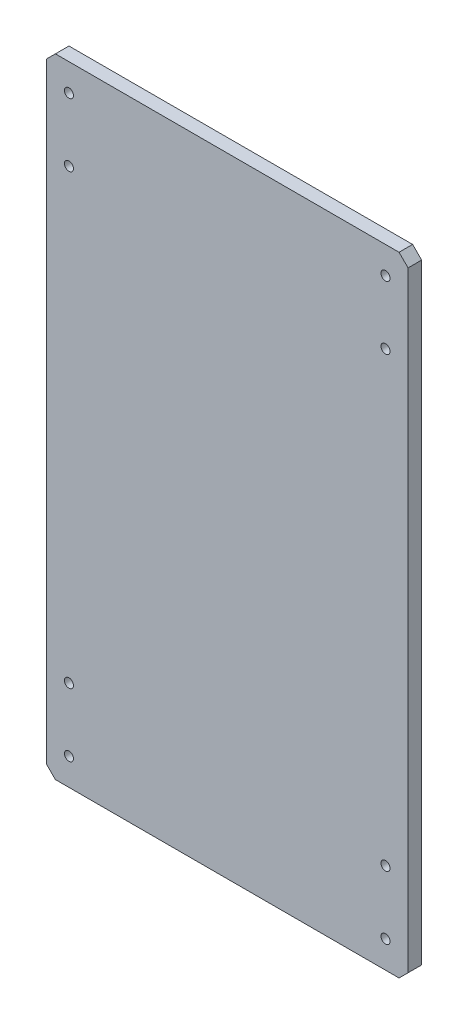
ISO-10303-21;
HEADER;
FILE_DESCRIPTION(('STEP AP214'),'2;1');
FILE_NAME('part.step','',(''),(''),'','','');
FILE_SCHEMA(('AUTOMOTIVE_DESIGN { 1 0 10303 214 1 1 1 1 }'));
ENDSEC;
DATA;
#1=APPLICATION_CONTEXT('core data for automotive mechanical design processes');
#2=APPLICATION_PROTOCOL_DEFINITION('international standard','automotive_design',2000,#1);
#3=PRODUCT_CONTEXT('',#1,'mechanical');
#4=PRODUCT('Part','Part','',(#3));
#5=PRODUCT_RELATED_PRODUCT_CATEGORY('part','',(#4));
#6=PRODUCT_DEFINITION_FORMATION('','',#4);
#7=PRODUCT_DEFINITION_CONTEXT('part definition',#1,'design');
#8=PRODUCT_DEFINITION('design','',#6,#7);
#9=PRODUCT_DEFINITION_SHAPE('','',#8);
#10=(LENGTH_UNIT() NAMED_UNIT(*) SI_UNIT(.MILLI.,.METRE.));
#11=(NAMED_UNIT(*) PLANE_ANGLE_UNIT() SI_UNIT($,.RADIAN.));
#12=(NAMED_UNIT(*) SI_UNIT($,.STERADIAN.) SOLID_ANGLE_UNIT());
#13=UNCERTAINTY_MEASURE_WITH_UNIT(LENGTH_MEASURE(1.E-05),#10,'distance_accuracy_value','');
#14=(GEOMETRIC_REPRESENTATION_CONTEXT(3) GLOBAL_UNCERTAINTY_ASSIGNED_CONTEXT((#13)) GLOBAL_UNIT_ASSIGNED_CONTEXT((#10,
#11,#12)) REPRESENTATION_CONTEXT('',''));
#15=CARTESIAN_POINT('',(0.,0.,0.));
#16=DIRECTION('',(0.,0.,1.));
#17=DIRECTION('',(1.,0.,0.));
#18=AXIS2_PLACEMENT_3D('',#15,#16,#17);
#19=CARTESIAN_POINT('',(-40.,-67.5,0.));
#20=DIRECTION('',(-0.707106781186548,-0.707106781186548,0.));
#21=DIRECTION('',(0.707106781186548,-0.707106781186548,0.));
#22=AXIS2_PLACEMENT_3D('',#19,#20,#21);
#23=PLANE('',#22);
#24=DIRECTION('',(0.707106781186547,-0.707106781186547,0.));
#25=VECTOR('',#24,1.);
#26=CARTESIAN_POINT('',(-40.,-67.5,3.));
#27=LINE('',#26,#25);
#28=CARTESIAN_POINT('',(-40.,-67.5,3.));
#29=VERTEX_POINT('',#28);
#30=CARTESIAN_POINT('',(-38.,-69.5,3.));
#31=VERTEX_POINT('',#30);
#32=EDGE_CURVE('E148',#29,#31,#27,.T.);
#33=ORIENTED_EDGE('',*,*,#32,.F.);
#34=DIRECTION('',(0.,0.,1.));
#35=VECTOR('',#34,1.);
#36=CARTESIAN_POINT('',(-40.,-67.5,0.));
#37=LINE('',#36,#35);
#38=CARTESIAN_POINT('',(-40.,-67.5,0.));
#39=VERTEX_POINT('',#38);
#40=EDGE_CURVE('E11',#39,#29,#37,.T.);
#41=ORIENTED_EDGE('',*,*,#40,.F.);
#42=DIRECTION('',(0.707106781186547,-0.707106781186547,0.));
#43=VECTOR('',#42,1.);
#44=CARTESIAN_POINT('',(-40.,-67.5,0.));
#45=LINE('',#44,#43);
#46=CARTESIAN_POINT('',(-38.,-69.5,0.));
#47=VERTEX_POINT('',#46);
#48=EDGE_CURVE('E177',#39,#47,#45,.T.);
#49=ORIENTED_EDGE('',*,*,#48,.T.);
#50=DIRECTION('',(0.,0.,1.));
#51=VECTOR('',#50,1.);
#52=CARTESIAN_POINT('',(-38.,-69.5,0.));
#53=LINE('',#52,#51);
#54=EDGE_CURVE('E48',#47,#31,#53,.T.);
#55=ORIENTED_EDGE('',*,*,#54,.T.);
#56=EDGE_LOOP('',(#33,#41,#49,#55));
#57=FACE_BOUND('',#56,.T.);
#58=ADVANCED_FACE('F45',(#57),#23,.T.);
#59=CARTESIAN_POINT('',(-40.,67.5,0.));
#60=DIRECTION('',(-1.,0.,0.));
#61=DIRECTION('',(0.,0.,1.));
#62=AXIS2_PLACEMENT_3D('',#59,#60,#61);
#63=PLANE('',#62);
#64=DIRECTION('',(0.,-1.,0.));
#65=VECTOR('',#64,1.);
#66=CARTESIAN_POINT('',(-40.,67.5,3.));
#67=LINE('',#66,#65);
#68=CARTESIAN_POINT('',(-40.,67.5,3.));
#69=VERTEX_POINT('',#68);
#70=EDGE_CURVE('E174',#69,#29,#67,.T.);
#71=ORIENTED_EDGE('',*,*,#70,.F.);
#72=DIRECTION('',(0.,0.,1.));
#73=VECTOR('',#72,1.);
#74=CARTESIAN_POINT('',(-40.,67.5,0.));
#75=LINE('',#74,#73);
#76=CARTESIAN_POINT('',(-40.,67.5,0.));
#77=VERTEX_POINT('',#76);
#78=EDGE_CURVE('E55',#77,#69,#75,.T.);
#79=ORIENTED_EDGE('',*,*,#78,.F.);
#80=DIRECTION('',(0.,-1.,0.));
#81=VECTOR('',#80,1.);
#82=CARTESIAN_POINT('',(-40.,67.5,0.));
#83=LINE('',#82,#81);
#84=EDGE_CURVE('E134',#77,#39,#83,.T.);
#85=ORIENTED_EDGE('',*,*,#84,.T.);
#86=ORIENTED_EDGE('',*,*,#40,.T.);
#87=EDGE_LOOP('',(#71,#79,#85,#86));
#88=FACE_BOUND('',#87,.T.);
#89=ADVANCED_FACE('F195',(#88),#63,.T.);
#90=CARTESIAN_POINT('',(-38.,69.5,0.));
#91=DIRECTION('',(-0.707106781186548,0.707106781186548,0.));
#92=DIRECTION('',(-0.707106781186548,-0.707106781186548,0.));
#93=AXIS2_PLACEMENT_3D('',#90,#91,#92);
#94=PLANE('',#93);
#95=DIRECTION('',(-0.707106781186547,-0.707106781186547,0.));
#96=VECTOR('',#95,1.);
#97=CARTESIAN_POINT('',(-38.,69.5,3.));
#98=LINE('',#97,#96);
#99=CARTESIAN_POINT('',(-38.,69.5,3.));
#100=VERTEX_POINT('',#99);
#101=EDGE_CURVE('E120',#100,#69,#98,.T.);
#102=ORIENTED_EDGE('',*,*,#101,.F.);
#103=DIRECTION('',(0.,0.,1.));
#104=VECTOR('',#103,1.);
#105=CARTESIAN_POINT('',(-38.,69.5,0.));
#106=LINE('',#105,#104);
#107=CARTESIAN_POINT('',(-38.,69.5,0.));
#108=VERTEX_POINT('',#107);
#109=EDGE_CURVE('E115',#108,#100,#106,.T.);
#110=ORIENTED_EDGE('',*,*,#109,.F.);
#111=DIRECTION('',(-0.707106781186547,-0.707106781186547,0.));
#112=VECTOR('',#111,1.);
#113=CARTESIAN_POINT('',(-38.,69.5,0.));
#114=LINE('',#113,#112);
#115=EDGE_CURVE('E118',#108,#77,#114,.T.);
#116=ORIENTED_EDGE('',*,*,#115,.T.);
#117=ORIENTED_EDGE('',*,*,#78,.T.);
#118=EDGE_LOOP('',(#102,#110,#116,#117));
#119=FACE_BOUND('',#118,.T.);
#120=ADVANCED_FACE('F117',(#119),#94,.T.);
#121=CARTESIAN_POINT('',(38.,69.5,0.));
#122=DIRECTION('',(0.,1.,0.));
#123=DIRECTION('',(0.,0.,1.));
#124=AXIS2_PLACEMENT_3D('',#121,#122,#123);
#125=PLANE('',#124);
#126=DIRECTION('',(-1.,0.,0.));
#127=VECTOR('',#126,1.);
#128=CARTESIAN_POINT('',(38.,69.5,3.));
#129=LINE('',#128,#127);
#130=CARTESIAN_POINT('',(38.,69.5,3.));
#131=VERTEX_POINT('',#130);
#132=EDGE_CURVE('E169',#131,#100,#129,.T.);
#133=ORIENTED_EDGE('',*,*,#132,.F.);
#134=DIRECTION('',(0.,0.,1.));
#135=VECTOR('',#134,1.);
#136=CARTESIAN_POINT('',(38.,69.5,0.));
#137=LINE('',#136,#135);
#138=CARTESIAN_POINT('',(38.,69.5,0.));
#139=VERTEX_POINT('',#138);
#140=EDGE_CURVE('E126',#139,#131,#137,.T.);
#141=ORIENTED_EDGE('',*,*,#140,.F.);
#142=DIRECTION('',(-1.,0.,0.));
#143=VECTOR('',#142,1.);
#144=CARTESIAN_POINT('',(38.,69.5,0.));
#145=LINE('',#144,#143);
#146=EDGE_CURVE('E132',#139,#108,#145,.T.);
#147=ORIENTED_EDGE('',*,*,#146,.T.);
#148=ORIENTED_EDGE('',*,*,#109,.T.);
#149=EDGE_LOOP('',(#133,#141,#147,#148));
#150=FACE_BOUND('',#149,.T.);
#151=ADVANCED_FACE('F137',(#150),#125,.T.);
#152=CARTESIAN_POINT('',(40.,67.5,0.));
#153=DIRECTION('',(0.707106781186548,0.707106781186548,0.));
#154=DIRECTION('',(-0.707106781186548,0.707106781186548,0.));
#155=AXIS2_PLACEMENT_3D('',#152,#153,#154);
#156=PLANE('',#155);
#157=DIRECTION('',(-0.707106781186547,0.707106781186547,0.));
#158=VECTOR('',#157,1.);
#159=CARTESIAN_POINT('',(40.,67.5,3.));
#160=LINE('',#159,#158);
#161=CARTESIAN_POINT('',(40.,67.5,3.));
#162=VERTEX_POINT('',#161);
#163=EDGE_CURVE('E165',#162,#131,#160,.T.);
#164=ORIENTED_EDGE('',*,*,#163,.F.);
#165=DIRECTION('',(0.,0.,1.));
#166=VECTOR('',#165,1.);
#167=CARTESIAN_POINT('',(40.,67.5,0.));
#168=LINE('',#167,#166);
#169=CARTESIAN_POINT('',(40.,67.5,0.));
#170=VERTEX_POINT('',#169);
#171=EDGE_CURVE('E183',#170,#162,#168,.T.);
#172=ORIENTED_EDGE('',*,*,#171,.F.);
#173=DIRECTION('',(-0.707106781186547,0.707106781186547,0.));
#174=VECTOR('',#173,1.);
#175=CARTESIAN_POINT('',(40.,67.5,0.));
#176=LINE('',#175,#174);
#177=EDGE_CURVE('E139',#170,#139,#176,.T.);
#178=ORIENTED_EDGE('',*,*,#177,.T.);
#179=ORIENTED_EDGE('',*,*,#140,.T.);
#180=EDGE_LOOP('',(#164,#172,#178,#179));
#181=FACE_BOUND('',#180,.T.);
#182=ADVANCED_FACE('F208',(#181),#156,.T.);
#183=CARTESIAN_POINT('',(40.,-67.5,0.));
#184=DIRECTION('',(1.,0.,0.));
#185=DIRECTION('',(0.,0.,-1.));
#186=AXIS2_PLACEMENT_3D('',#183,#184,#185);
#187=PLANE('',#186);
#188=DIRECTION('',(0.,1.,0.));
#189=VECTOR('',#188,1.);
#190=CARTESIAN_POINT('',(40.,-67.5,3.));
#191=LINE('',#190,#189);
#192=CARTESIAN_POINT('',(40.,-67.5,3.));
#193=VERTEX_POINT('',#192);
#194=EDGE_CURVE('E161',#193,#162,#191,.T.);
#195=ORIENTED_EDGE('',*,*,#194,.F.);
#196=DIRECTION('',(0.,0.,1.));
#197=VECTOR('',#196,1.);
#198=CARTESIAN_POINT('',(40.,-67.5,0.));
#199=LINE('',#198,#197);
#200=CARTESIAN_POINT('',(40.,-67.5,0.));
#201=VERTEX_POINT('',#200);
#202=EDGE_CURVE('E186',#201,#193,#199,.T.);
#203=ORIENTED_EDGE('',*,*,#202,.F.);
#204=DIRECTION('',(0.,1.,0.));
#205=VECTOR('',#204,1.);
#206=CARTESIAN_POINT('',(40.,-67.5,0.));
#207=LINE('',#206,#205);
#208=EDGE_CURVE('E142',#201,#170,#207,.T.);
#209=ORIENTED_EDGE('',*,*,#208,.T.);
#210=ORIENTED_EDGE('',*,*,#171,.T.);
#211=EDGE_LOOP('',(#195,#203,#209,#210));
#212=FACE_BOUND('',#211,.T.);
#213=ADVANCED_FACE('F211',(#212),#187,.T.);
#214=CARTESIAN_POINT('',(38.,-69.5,0.));
#215=DIRECTION('',(0.707106781186548,-0.707106781186548,0.));
#216=DIRECTION('',(0.707106781186548,0.707106781186548,0.));
#217=AXIS2_PLACEMENT_3D('',#214,#215,#216);
#218=PLANE('',#217);
#219=DIRECTION('',(0.707106781186547,0.707106781186547,0.));
#220=VECTOR('',#219,1.);
#221=CARTESIAN_POINT('',(38.,-69.5,3.));
#222=LINE('',#221,#220);
#223=CARTESIAN_POINT('',(38.,-69.5,3.));
#224=VERTEX_POINT('',#223);
#225=EDGE_CURVE('E157',#224,#193,#222,.T.);
#226=ORIENTED_EDGE('',*,*,#225,.F.);
#227=DIRECTION('',(0.,0.,1.));
#228=VECTOR('',#227,1.);
#229=CARTESIAN_POINT('',(38.,-69.5,0.));
#230=LINE('',#229,#228);
#231=CARTESIAN_POINT('',(38.,-69.5,0.));
#232=VERTEX_POINT('',#231);
#233=EDGE_CURVE('E188',#232,#224,#230,.T.);
#234=ORIENTED_EDGE('',*,*,#233,.F.);
#235=DIRECTION('',(0.707106781186547,0.707106781186547,0.));
#236=VECTOR('',#235,1.);
#237=CARTESIAN_POINT('',(38.,-69.5,0.));
#238=LINE('',#237,#236);
#239=EDGE_CURVE('E335',#232,#201,#238,.T.);
#240=ORIENTED_EDGE('',*,*,#239,.T.);
#241=ORIENTED_EDGE('',*,*,#202,.T.);
#242=EDGE_LOOP('',(#226,#234,#240,#241));
#243=FACE_BOUND('',#242,.T.);
#244=ADVANCED_FACE('F215',(#243),#218,.T.);
#245=CARTESIAN_POINT('',(-38.,-69.5,0.));
#246=DIRECTION('',(0.,-1.,0.));
#247=DIRECTION('',(0.,0.,-1.));
#248=AXIS2_PLACEMENT_3D('',#245,#246,#247);
#249=PLANE('',#248);
#250=DIRECTION('',(1.,0.,0.));
#251=VECTOR('',#250,1.);
#252=CARTESIAN_POINT('',(-38.,-69.5,3.));
#253=LINE('',#252,#251);
#254=EDGE_CURVE('E152',#31,#224,#253,.T.);
#255=ORIENTED_EDGE('',*,*,#254,.F.);
#256=ORIENTED_EDGE('',*,*,#54,.F.);
#257=DIRECTION('',(1.,0.,0.));
#258=VECTOR('',#257,1.);
#259=CARTESIAN_POINT('',(-38.,-69.5,0.));
#260=LINE('',#259,#258);
#261=EDGE_CURVE('E332',#47,#232,#260,.T.);
#262=ORIENTED_EDGE('',*,*,#261,.T.);
#263=ORIENTED_EDGE('',*,*,#233,.T.);
#264=EDGE_LOOP('',(#255,#256,#262,#263));
#265=FACE_BOUND('',#264,.T.);
#266=ADVANCED_FACE('F192',(#265),#249,.T.);
#267=CARTESIAN_POINT('',(0.,0.,0.));
#268=DIRECTION('',(0.,0.,1.));
#269=DIRECTION('',(1.,0.,0.));
#270=AXIS2_PLACEMENT_3D('',#267,#268,#269);
#271=PLANE('',#270);
#272=CARTESIAN_POINT('',(35.,-63.5,0.));
#273=DIRECTION('',(0.,0.,1.));
#274=DIRECTION('',(-1.,0.,0.));
#275=AXIS2_PLACEMENT_3D('',#272,#273,#274);
#276=CIRCLE('',#275,1.);
#277=CARTESIAN_POINT('',(34.,-63.5,0.));
#278=VERTEX_POINT('',#277);
#279=EDGE_CURVE('E266',#278,#278,#276,.T.);
#280=ORIENTED_EDGE('',*,*,#279,.T.);
#281=EDGE_LOOP('',(#280));
#282=FACE_BOUND('',#281,.T.);
#283=CARTESIAN_POINT('',(35.,-49.5,0.));
#284=DIRECTION('',(0.,0.,1.));
#285=DIRECTION('',(-1.,0.,0.));
#286=AXIS2_PLACEMENT_3D('',#283,#284,#285);
#287=CIRCLE('',#286,1.);
#288=CARTESIAN_POINT('',(34.,-49.5,0.));
#289=VERTEX_POINT('',#288);
#290=EDGE_CURVE('E276',#289,#289,#287,.T.);
#291=ORIENTED_EDGE('',*,*,#290,.T.);
#292=EDGE_LOOP('',(#291));
#293=FACE_BOUND('',#292,.T.);
#294=CARTESIAN_POINT('',(-35.,63.5,0.));
#295=DIRECTION('',(0.,0.,1.));
#296=DIRECTION('',(-1.,0.,0.));
#297=AXIS2_PLACEMENT_3D('',#294,#295,#296);
#298=CIRCLE('',#297,1.);
#299=CARTESIAN_POINT('',(-36.,63.5,0.));
#300=VERTEX_POINT('',#299);
#301=EDGE_CURVE('E284',#300,#300,#298,.T.);
#302=ORIENTED_EDGE('',*,*,#301,.T.);
#303=EDGE_LOOP('',(#302));
#304=FACE_BOUND('',#303,.T.);
#305=CARTESIAN_POINT('',(-35.,49.5,0.));
#306=DIRECTION('',(0.,0.,1.));
#307=DIRECTION('',(-1.,0.,0.));
#308=AXIS2_PLACEMENT_3D('',#305,#306,#307);
#309=CIRCLE('',#308,1.);
#310=CARTESIAN_POINT('',(-36.,49.5,0.));
#311=VERTEX_POINT('',#310);
#312=EDGE_CURVE('E292',#311,#311,#309,.T.);
#313=ORIENTED_EDGE('',*,*,#312,.T.);
#314=EDGE_LOOP('',(#313));
#315=FACE_BOUND('',#314,.T.);
#316=CARTESIAN_POINT('',(-35.,-49.5,0.));
#317=DIRECTION('',(0.,0.,1.));
#318=DIRECTION('',(-1.,0.,0.));
#319=AXIS2_PLACEMENT_3D('',#316,#317,#318);
#320=CIRCLE('',#319,1.);
#321=CARTESIAN_POINT('',(-36.,-49.5,0.));
#322=VERTEX_POINT('',#321);
#323=EDGE_CURVE('E300',#322,#322,#320,.T.);
#324=ORIENTED_EDGE('',*,*,#323,.T.);
#325=EDGE_LOOP('',(#324));
#326=FACE_BOUND('',#325,.T.);
#327=CARTESIAN_POINT('',(35.,63.5,0.));
#328=DIRECTION('',(0.,0.,1.));
#329=DIRECTION('',(-1.,0.,0.));
#330=AXIS2_PLACEMENT_3D('',#327,#328,#329);
#331=CIRCLE('',#330,1.);
#332=CARTESIAN_POINT('',(34.,63.5,0.));
#333=VERTEX_POINT('',#332);
#334=EDGE_CURVE('E308',#333,#333,#331,.T.);
#335=ORIENTED_EDGE('',*,*,#334,.T.);
#336=EDGE_LOOP('',(#335));
#337=FACE_BOUND('',#336,.T.);
#338=CARTESIAN_POINT('',(-35.,-63.5,0.));
#339=DIRECTION('',(0.,0.,1.));
#340=DIRECTION('',(-1.,0.,0.));
#341=AXIS2_PLACEMENT_3D('',#338,#339,#340);
#342=CIRCLE('',#341,1.);
#343=CARTESIAN_POINT('',(-36.,-63.5,0.));
#344=VERTEX_POINT('',#343);
#345=EDGE_CURVE('E316',#344,#344,#342,.T.);
#346=ORIENTED_EDGE('',*,*,#345,.T.);
#347=EDGE_LOOP('',(#346));
#348=FACE_BOUND('',#347,.T.);
#349=CARTESIAN_POINT('',(35.,49.5,0.));
#350=DIRECTION('',(0.,0.,1.));
#351=DIRECTION('',(-1.,0.,0.));
#352=AXIS2_PLACEMENT_3D('',#349,#350,#351);
#353=CIRCLE('',#352,1.);
#354=CARTESIAN_POINT('',(34.,49.5,0.));
#355=VERTEX_POINT('',#354);
#356=EDGE_CURVE('E153',#355,#355,#353,.T.);
#357=ORIENTED_EDGE('',*,*,#356,.T.);
#358=EDGE_LOOP('',(#357));
#359=FACE_BOUND('',#358,.T.);
#360=ORIENTED_EDGE('',*,*,#48,.F.);
#361=ORIENTED_EDGE('',*,*,#84,.F.);
#362=ORIENTED_EDGE('',*,*,#115,.F.);
#363=ORIENTED_EDGE('',*,*,#146,.F.);
#364=ORIENTED_EDGE('',*,*,#177,.F.);
#365=ORIENTED_EDGE('',*,*,#208,.F.);
#366=ORIENTED_EDGE('',*,*,#239,.F.);
#367=ORIENTED_EDGE('',*,*,#261,.F.);
#368=EDGE_LOOP('',(#360,#361,#362,#363,#364,#365,#366,#367));
#369=FACE_BOUND('',#368,.T.);
#370=ADVANCED_FACE('F130',(#282,#293,#304,#315,#326,#337,#348,#359,#369),#271,.F.);
#371=CARTESIAN_POINT('',(0.,0.,3.));
#372=DIRECTION('',(0.,0.,1.));
#373=DIRECTION('',(1.,0.,0.));
#374=AXIS2_PLACEMENT_3D('',#371,#372,#373);
#375=PLANE('',#374);
#376=CARTESIAN_POINT('',(35.,-63.5,3.));
#377=DIRECTION('',(0.,0.,1.));
#378=DIRECTION('',(-1.,0.,0.));
#379=AXIS2_PLACEMENT_3D('',#376,#377,#378);
#380=CIRCLE('',#379,1.);
#381=CARTESIAN_POINT('',(34.,-63.5,3.));
#382=VERTEX_POINT('',#381);
#383=EDGE_CURVE('E269',#382,#382,#380,.T.);
#384=ORIENTED_EDGE('',*,*,#383,.F.);
#385=EDGE_LOOP('',(#384));
#386=FACE_BOUND('',#385,.T.);
#387=CARTESIAN_POINT('',(35.,-49.5,3.));
#388=DIRECTION('',(0.,0.,1.));
#389=DIRECTION('',(-1.,0.,0.));
#390=AXIS2_PLACEMENT_3D('',#387,#388,#389);
#391=CIRCLE('',#390,1.);
#392=CARTESIAN_POINT('',(34.,-49.5,3.));
#393=VERTEX_POINT('',#392);
#394=EDGE_CURVE('E273',#393,#393,#391,.T.);
#395=ORIENTED_EDGE('',*,*,#394,.F.);
#396=EDGE_LOOP('',(#395));
#397=FACE_BOUND('',#396,.T.);
#398=CARTESIAN_POINT('',(-35.,63.5,3.));
#399=DIRECTION('',(0.,0.,1.));
#400=DIRECTION('',(-1.,0.,0.));
#401=AXIS2_PLACEMENT_3D('',#398,#399,#400);
#402=CIRCLE('',#401,1.);
#403=CARTESIAN_POINT('',(-36.,63.5,3.));
#404=VERTEX_POINT('',#403);
#405=EDGE_CURVE('E280',#404,#404,#402,.T.);
#406=ORIENTED_EDGE('',*,*,#405,.F.);
#407=EDGE_LOOP('',(#406));
#408=FACE_BOUND('',#407,.T.);
#409=CARTESIAN_POINT('',(-35.,49.5,3.));
#410=DIRECTION('',(0.,0.,1.));
#411=DIRECTION('',(-1.,0.,0.));
#412=AXIS2_PLACEMENT_3D('',#409,#410,#411);
#413=CIRCLE('',#412,1.);
#414=CARTESIAN_POINT('',(-36.,49.5,3.));
#415=VERTEX_POINT('',#414);
#416=EDGE_CURVE('E288',#415,#415,#413,.T.);
#417=ORIENTED_EDGE('',*,*,#416,.F.);
#418=EDGE_LOOP('',(#417));
#419=FACE_BOUND('',#418,.T.);
#420=CARTESIAN_POINT('',(-35.,-49.5,3.));
#421=DIRECTION('',(0.,0.,1.));
#422=DIRECTION('',(-1.,0.,0.));
#423=AXIS2_PLACEMENT_3D('',#420,#421,#422);
#424=CIRCLE('',#423,1.);
#425=CARTESIAN_POINT('',(-36.,-49.5,3.));
#426=VERTEX_POINT('',#425);
#427=EDGE_CURVE('E296',#426,#426,#424,.T.);
#428=ORIENTED_EDGE('',*,*,#427,.F.);
#429=EDGE_LOOP('',(#428));
#430=FACE_BOUND('',#429,.T.);
#431=CARTESIAN_POINT('',(35.,63.5,3.));
#432=DIRECTION('',(0.,0.,1.));
#433=DIRECTION('',(-1.,0.,0.));
#434=AXIS2_PLACEMENT_3D('',#431,#432,#433);
#435=CIRCLE('',#434,1.);
#436=CARTESIAN_POINT('',(34.,63.5,3.));
#437=VERTEX_POINT('',#436);
#438=EDGE_CURVE('E304',#437,#437,#435,.T.);
#439=ORIENTED_EDGE('',*,*,#438,.F.);
#440=EDGE_LOOP('',(#439));
#441=FACE_BOUND('',#440,.T.);
#442=CARTESIAN_POINT('',(-35.,-63.5,3.));
#443=DIRECTION('',(0.,0.,1.));
#444=DIRECTION('',(-1.,0.,0.));
#445=AXIS2_PLACEMENT_3D('',#442,#443,#444);
#446=CIRCLE('',#445,1.);
#447=CARTESIAN_POINT('',(-36.,-63.5,3.));
#448=VERTEX_POINT('',#447);
#449=EDGE_CURVE('E312',#448,#448,#446,.T.);
#450=ORIENTED_EDGE('',*,*,#449,.F.);
#451=EDGE_LOOP('',(#450));
#452=FACE_BOUND('',#451,.T.);
#453=CARTESIAN_POINT('',(35.,49.5,3.));
#454=DIRECTION('',(0.,0.,1.));
#455=DIRECTION('',(-1.,0.,0.));
#456=AXIS2_PLACEMENT_3D('',#453,#454,#455);
#457=CIRCLE('',#456,1.);
#458=CARTESIAN_POINT('',(34.,49.5,3.));
#459=VERTEX_POINT('',#458);
#460=EDGE_CURVE('E320',#459,#459,#457,.T.);
#461=ORIENTED_EDGE('',*,*,#460,.F.);
#462=EDGE_LOOP('',(#461));
#463=FACE_BOUND('',#462,.T.);
#464=ORIENTED_EDGE('',*,*,#32,.T.);
#465=ORIENTED_EDGE('',*,*,#254,.T.);
#466=ORIENTED_EDGE('',*,*,#225,.T.);
#467=ORIENTED_EDGE('',*,*,#194,.T.);
#468=ORIENTED_EDGE('',*,*,#163,.T.);
#469=ORIENTED_EDGE('',*,*,#132,.T.);
#470=ORIENTED_EDGE('',*,*,#101,.T.);
#471=ORIENTED_EDGE('',*,*,#70,.T.);
#472=EDGE_LOOP('',(#464,#465,#466,#467,#468,#469,#470,#471));
#473=FACE_BOUND('',#472,.T.);
#474=ADVANCED_FACE('F194',(#386,#397,#408,#419,#430,#441,#452,#463,#473),#375,.T.);
#475=CARTESIAN_POINT('',(35.,49.5,0.));
#476=DIRECTION('',(0.,0.,1.));
#477=DIRECTION('',(1.,0.,0.));
#478=AXIS2_PLACEMENT_3D('',#475,#476,#477);
#479=CYLINDRICAL_SURFACE('',#478,1.);
#480=ORIENTED_EDGE('',*,*,#356,.F.);
#481=EDGE_LOOP('',(#480));
#482=FACE_BOUND('',#481,.T.);
#483=ORIENTED_EDGE('',*,*,#460,.T.);
#484=EDGE_LOOP('',(#483));
#485=FACE_BOUND('',#484,.T.);
#486=ADVANCED_FACE('F227',(#482,#485),#479,.F.);
#487=CARTESIAN_POINT('',(-35.,-63.5,0.));
#488=DIRECTION('',(0.,0.,1.));
#489=DIRECTION('',(1.,0.,0.));
#490=AXIS2_PLACEMENT_3D('',#487,#488,#489);
#491=CYLINDRICAL_SURFACE('',#490,1.);
#492=ORIENTED_EDGE('',*,*,#345,.F.);
#493=EDGE_LOOP('',(#492));
#494=FACE_BOUND('',#493,.T.);
#495=ORIENTED_EDGE('',*,*,#449,.T.);
#496=EDGE_LOOP('',(#495));
#497=FACE_BOUND('',#496,.T.);
#498=ADVANCED_FACE('F234',(#494,#497),#491,.F.);
#499=CARTESIAN_POINT('',(35.,63.5,0.));
#500=DIRECTION('',(0.,0.,1.));
#501=DIRECTION('',(1.,0.,0.));
#502=AXIS2_PLACEMENT_3D('',#499,#500,#501);
#503=CYLINDRICAL_SURFACE('',#502,1.);
#504=ORIENTED_EDGE('',*,*,#334,.F.);
#505=EDGE_LOOP('',(#504));
#506=FACE_BOUND('',#505,.T.);
#507=ORIENTED_EDGE('',*,*,#438,.T.);
#508=EDGE_LOOP('',(#507));
#509=FACE_BOUND('',#508,.T.);
#510=ADVANCED_FACE('F238',(#506,#509),#503,.F.);
#511=CARTESIAN_POINT('',(-35.,-49.5,0.));
#512=DIRECTION('',(0.,0.,1.));
#513=DIRECTION('',(1.,0.,0.));
#514=AXIS2_PLACEMENT_3D('',#511,#512,#513);
#515=CYLINDRICAL_SURFACE('',#514,1.);
#516=ORIENTED_EDGE('',*,*,#323,.F.);
#517=EDGE_LOOP('',(#516));
#518=FACE_BOUND('',#517,.T.);
#519=ORIENTED_EDGE('',*,*,#427,.T.);
#520=EDGE_LOOP('',(#519));
#521=FACE_BOUND('',#520,.T.);
#522=ADVANCED_FACE('F242',(#518,#521),#515,.F.);
#523=CARTESIAN_POINT('',(-35.,49.5,0.));
#524=DIRECTION('',(0.,0.,1.));
#525=DIRECTION('',(1.,0.,0.));
#526=AXIS2_PLACEMENT_3D('',#523,#524,#525);
#527=CYLINDRICAL_SURFACE('',#526,1.);
#528=ORIENTED_EDGE('',*,*,#312,.F.);
#529=EDGE_LOOP('',(#528));
#530=FACE_BOUND('',#529,.T.);
#531=ORIENTED_EDGE('',*,*,#416,.T.);
#532=EDGE_LOOP('',(#531));
#533=FACE_BOUND('',#532,.T.);
#534=ADVANCED_FACE('F246',(#530,#533),#527,.F.);
#535=CARTESIAN_POINT('',(-35.,63.5,0.));
#536=DIRECTION('',(0.,0.,1.));
#537=DIRECTION('',(1.,0.,0.));
#538=AXIS2_PLACEMENT_3D('',#535,#536,#537);
#539=CYLINDRICAL_SURFACE('',#538,1.);
#540=ORIENTED_EDGE('',*,*,#301,.F.);
#541=EDGE_LOOP('',(#540));
#542=FACE_BOUND('',#541,.T.);
#543=ORIENTED_EDGE('',*,*,#405,.T.);
#544=EDGE_LOOP('',(#543));
#545=FACE_BOUND('',#544,.T.);
#546=ADVANCED_FACE('F250',(#542,#545),#539,.F.);
#547=CARTESIAN_POINT('',(35.,-49.5,0.));
#548=DIRECTION('',(0.,0.,1.));
#549=DIRECTION('',(1.,0.,0.));
#550=AXIS2_PLACEMENT_3D('',#547,#548,#549);
#551=CYLINDRICAL_SURFACE('',#550,1.);
#552=ORIENTED_EDGE('',*,*,#290,.F.);
#553=EDGE_LOOP('',(#552));
#554=FACE_BOUND('',#553,.T.);
#555=ORIENTED_EDGE('',*,*,#394,.T.);
#556=EDGE_LOOP('',(#555));
#557=FACE_BOUND('',#556,.T.);
#558=ADVANCED_FACE('F254',(#554,#557),#551,.F.);
#559=CARTESIAN_POINT('',(35.,-63.5,0.));
#560=DIRECTION('',(0.,0.,1.));
#561=DIRECTION('',(1.,0.,0.));
#562=AXIS2_PLACEMENT_3D('',#559,#560,#561);
#563=CYLINDRICAL_SURFACE('',#562,1.);
#564=ORIENTED_EDGE('',*,*,#279,.F.);
#565=EDGE_LOOP('',(#564));
#566=FACE_BOUND('',#565,.T.);
#567=ORIENTED_EDGE('',*,*,#383,.T.);
#568=EDGE_LOOP('',(#567));
#569=FACE_BOUND('',#568,.T.);
#570=ADVANCED_FACE('F258',(#566,#569),#563,.F.);
#571=CLOSED_SHELL('',(#58,#89,#120,#151,#182,#213,#244,#266,#370,#474,#486,#498,#510,#522,#534,
#546,#558,#570));
#572=MANIFOLD_SOLID_BREP('B2',#571);
#573=ADVANCED_BREP_SHAPE_REPRESENTATION('',(#18,#572),#14);
#574=SHAPE_DEFINITION_REPRESENTATION(#9,#573);
ENDSEC;
END-ISO-10303-21;
